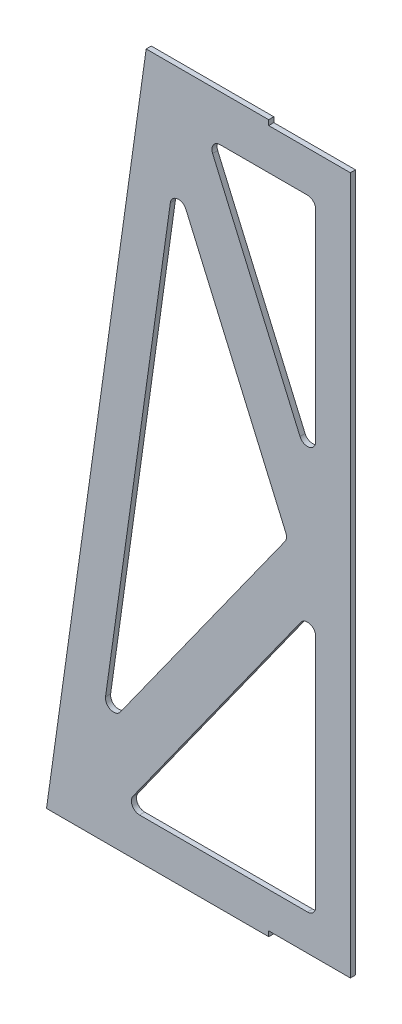
ISO-10303-21;
HEADER;
FILE_DESCRIPTION(('STEP AP214'),'2;1');
FILE_NAME('part.step','',(''),(''),'','','');
FILE_SCHEMA(('AUTOMOTIVE_DESIGN { 1 0 10303 214 1 1 1 1 }'));
ENDSEC;
DATA;
#1=APPLICATION_CONTEXT('core data for automotive mechanical design processes');
#2=APPLICATION_PROTOCOL_DEFINITION('international standard','automotive_design',2000,#1);
#3=PRODUCT_CONTEXT('',#1,'mechanical');
#4=PRODUCT('Part','Part','',(#3));
#5=PRODUCT_RELATED_PRODUCT_CATEGORY('part','',(#4));
#6=PRODUCT_DEFINITION_FORMATION('','',#4);
#7=PRODUCT_DEFINITION_CONTEXT('part definition',#1,'design');
#8=PRODUCT_DEFINITION('design','',#6,#7);
#9=PRODUCT_DEFINITION_SHAPE('','',#8);
#10=(LENGTH_UNIT() NAMED_UNIT(*) SI_UNIT(.MILLI.,.METRE.));
#11=(NAMED_UNIT(*) PLANE_ANGLE_UNIT() SI_UNIT($,.RADIAN.));
#12=(NAMED_UNIT(*) SI_UNIT($,.STERADIAN.) SOLID_ANGLE_UNIT());
#13=UNCERTAINTY_MEASURE_WITH_UNIT(LENGTH_MEASURE(1.E-05),#10,'distance_accuracy_value','');
#14=(GEOMETRIC_REPRESENTATION_CONTEXT(3) GLOBAL_UNCERTAINTY_ASSIGNED_CONTEXT((#13)) GLOBAL_UNIT_ASSIGNED_CONTEXT((#10,
#11,#12)) REPRESENTATION_CONTEXT('',''));
#15=CARTESIAN_POINT('',(0.,0.,0.));
#16=DIRECTION('',(0.,0.,1.));
#17=DIRECTION('',(1.,0.,0.));
#18=AXIS2_PLACEMENT_3D('',#15,#16,#17);
#19=CARTESIAN_POINT('',(38.1,12.9979716705998,1.5875));
#20=DIRECTION('',(0.,-1.,0.));
#21=DIRECTION('',(0.,0.,-1.));
#22=AXIS2_PLACEMENT_3D('',#19,#20,#21);
#23=PLANE('',#22);
#24=DIRECTION('',(-1.,0.,0.));
#25=VECTOR('',#24,1.);
#26=CARTESIAN_POINT('',(38.1,12.9979716705998,0.));
#27=LINE('',#26,#25);
#28=CARTESIAN_POINT('',(63.5,12.9979716705998,0.));
#29=VERTEX_POINT('',#28);
#30=CARTESIAN_POINT('',(38.1,12.9979716705998,0.));
#31=VERTEX_POINT('',#30);
#32=EDGE_CURVE('E233',#29,#31,#27,.T.);
#33=ORIENTED_EDGE('',*,*,#32,.T.);
#34=DIRECTION('',(0.,0.,-1.));
#35=VECTOR('',#34,1.);
#36=CARTESIAN_POINT('',(38.1,12.9979716705998,1.5875));
#37=LINE('',#36,#35);
#38=CARTESIAN_POINT('',(38.1,12.9979716705998,1.5875));
#39=VERTEX_POINT('',#38);
#40=EDGE_CURVE('E256',#39,#31,#37,.T.);
#41=ORIENTED_EDGE('',*,*,#40,.F.);
#42=DIRECTION('',(-1.,0.,0.));
#43=VECTOR('',#42,1.);
#44=CARTESIAN_POINT('',(38.1,12.9979716705998,1.5875));
#45=LINE('',#44,#43);
#46=CARTESIAN_POINT('',(63.5,12.9979716705998,1.5875));
#47=VERTEX_POINT('',#46);
#48=EDGE_CURVE('E234',#47,#39,#45,.T.);
#49=ORIENTED_EDGE('',*,*,#48,.F.);
#50=DIRECTION('',(0.,0.,-1.));
#51=VECTOR('',#50,1.);
#52=CARTESIAN_POINT('',(63.5,12.9979716705998,1.5875));
#53=LINE('',#52,#51);
#54=EDGE_CURVE('E245',#47,#29,#53,.T.);
#55=ORIENTED_EDGE('',*,*,#54,.T.);
#56=EDGE_LOOP('',(#33,#41,#49,#55));
#57=FACE_BOUND('',#56,.T.);
#58=ADVANCED_FACE('F37',(#57),#23,.F.);
#59=CARTESIAN_POINT('',(38.1,14.5854716705998,1.5875));
#60=DIRECTION('',(-1.,0.,0.));
#61=DIRECTION('',(0.,0.,1.));
#62=AXIS2_PLACEMENT_3D('',#59,#60,#61);
#63=PLANE('',#62);
#64=DIRECTION('',(0.,1.,0.));
#65=VECTOR('',#64,1.);
#66=CARTESIAN_POINT('',(38.1,14.5854716705998,0.));
#67=LINE('',#66,#65);
#68=CARTESIAN_POINT('',(38.1,14.5854716705998,0.));
#69=VERTEX_POINT('',#68);
#70=EDGE_CURVE('E418',#31,#69,#67,.T.);
#71=ORIENTED_EDGE('',*,*,#70,.T.);
#72=DIRECTION('',(0.,0.,-1.));
#73=VECTOR('',#72,1.);
#74=CARTESIAN_POINT('',(38.1,14.5854716705998,1.5875));
#75=LINE('',#74,#73);
#76=CARTESIAN_POINT('',(38.1,14.5854716705998,1.5875));
#77=VERTEX_POINT('',#76);
#78=EDGE_CURVE('E253',#77,#69,#75,.T.);
#79=ORIENTED_EDGE('',*,*,#78,.F.);
#80=DIRECTION('',(0.,1.,0.));
#81=VECTOR('',#80,1.);
#82=CARTESIAN_POINT('',(38.1,14.5854716705998,1.5875));
#83=LINE('',#82,#81);
#84=EDGE_CURVE('E238',#39,#77,#83,.T.);
#85=ORIENTED_EDGE('',*,*,#84,.F.);
#86=ORIENTED_EDGE('',*,*,#40,.T.);
#87=EDGE_LOOP('',(#71,#79,#85,#86));
#88=FACE_BOUND('',#87,.T.);
#89=ADVANCED_FACE('F448',(#88),#63,.F.);
#90=CARTESIAN_POINT('',(0.,14.5854716705998,1.5875));
#91=DIRECTION('',(0.,-1.,0.));
#92=DIRECTION('',(0.,0.,-1.));
#93=AXIS2_PLACEMENT_3D('',#90,#91,#92);
#94=PLANE('',#93);
#95=DIRECTION('',(-1.,0.,0.));
#96=VECTOR('',#95,1.);
#97=CARTESIAN_POINT('',(0.,14.5854716705998,0.));
#98=LINE('',#97,#96);
#99=CARTESIAN_POINT('',(0.,14.5854716705998,0.));
#100=VERTEX_POINT('',#99);
#101=EDGE_CURVE('E420',#69,#100,#98,.T.);
#102=ORIENTED_EDGE('',*,*,#101,.T.);
#103=DIRECTION('',(0.,0.,-1.));
#104=VECTOR('',#103,1.);
#105=CARTESIAN_POINT('',(0.,14.5854716705998,1.5875));
#106=LINE('',#105,#104);
#107=CARTESIAN_POINT('',(0.,14.5854716705998,1.5875));
#108=VERTEX_POINT('',#107);
#109=EDGE_CURVE('E250',#108,#100,#106,.T.);
#110=ORIENTED_EDGE('',*,*,#109,.F.);
#111=DIRECTION('',(-1.,0.,0.));
#112=VECTOR('',#111,1.);
#113=CARTESIAN_POINT('',(0.,14.5854716705998,1.5875));
#114=LINE('',#113,#112);
#115=EDGE_CURVE('E409',#77,#108,#114,.T.);
#116=ORIENTED_EDGE('',*,*,#115,.F.);
#117=ORIENTED_EDGE('',*,*,#78,.T.);
#118=EDGE_LOOP('',(#102,#110,#116,#117));
#119=FACE_BOUND('',#118,.T.);
#120=ADVANCED_FACE('F445',(#119),#94,.F.);
#121=CARTESIAN_POINT('',(-30.988,-205.4420283294,1.5875));
#122=DIRECTION('',(0.990227616842421,-0.139460628288341,0.));
#123=DIRECTION('',(0.139460628288341,0.990227616842421,0.));
#124=AXIS2_PLACEMENT_3D('',#121,#122,#123);
#125=PLANE('',#124);
#126=DIRECTION('',(-0.139460628288341,-0.990227616842421,0.));
#127=VECTOR('',#126,1.);
#128=CARTESIAN_POINT('',(-30.988,-205.4420283294,0.));
#129=LINE('',#128,#127);
#130=CARTESIAN_POINT('',(-30.988,-205.4420283294,0.));
#131=VERTEX_POINT('',#130);
#132=EDGE_CURVE('E241',#100,#131,#129,.T.);
#133=ORIENTED_EDGE('',*,*,#132,.T.);
#134=DIRECTION('',(0.,0.,-1.));
#135=VECTOR('',#134,1.);
#136=CARTESIAN_POINT('',(-30.988,-205.4420283294,1.5875));
#137=LINE('',#136,#135);
#138=CARTESIAN_POINT('',(-30.988,-205.4420283294,1.5875));
#139=VERTEX_POINT('',#138);
#140=EDGE_CURVE('E247',#139,#131,#137,.T.);
#141=ORIENTED_EDGE('',*,*,#140,.F.);
#142=DIRECTION('',(-0.139460628288341,-0.990227616842421,0.));
#143=VECTOR('',#142,1.);
#144=CARTESIAN_POINT('',(-30.988,-205.4420283294,1.5875));
#145=LINE('',#144,#143);
#146=EDGE_CURVE('E411',#108,#139,#145,.T.);
#147=ORIENTED_EDGE('',*,*,#146,.F.);
#148=ORIENTED_EDGE('',*,*,#109,.T.);
#149=EDGE_LOOP('',(#133,#141,#147,#148));
#150=FACE_BOUND('',#149,.T.);
#151=ADVANCED_FACE('F424',(#150),#125,.F.);
#152=CARTESIAN_POINT('',(63.5,-205.4420283294,1.5875));
#153=DIRECTION('',(0.,1.,0.));
#154=DIRECTION('',(-1.,0.,0.));
#155=AXIS2_PLACEMENT_3D('',#152,#153,#154);
#156=PLANE('',#155);
#157=DIRECTION('',(1.,0.,0.));
#158=VECTOR('',#157,1.);
#159=CARTESIAN_POINT('',(63.5,-205.4420283294,0.));
#160=LINE('',#159,#158);
#161=CARTESIAN_POINT('',(38.1,-205.4420283294,0.));
#162=VERTEX_POINT('',#161);
#163=EDGE_CURVE('E235',#131,#162,#160,.T.);
#164=ORIENTED_EDGE('',*,*,#163,.T.);
#165=DIRECTION('',(0.,0.,1.));
#166=VECTOR('',#165,1.);
#167=CARTESIAN_POINT('',(38.1,-205.4420283294,0.));
#168=LINE('',#167,#166);
#169=CARTESIAN_POINT('',(38.1,-205.4420283294,1.5875));
#170=VERTEX_POINT('',#169);
#171=EDGE_CURVE('E351',#162,#170,#168,.T.);
#172=ORIENTED_EDGE('',*,*,#171,.T.);
#173=DIRECTION('',(1.,0.,0.));
#174=VECTOR('',#173,1.);
#175=CARTESIAN_POINT('',(63.5,-205.4420283294,1.5875));
#176=LINE('',#175,#174);
#177=EDGE_CURVE('E413',#139,#170,#176,.T.);
#178=ORIENTED_EDGE('',*,*,#177,.F.);
#179=ORIENTED_EDGE('',*,*,#140,.T.);
#180=EDGE_LOOP('',(#164,#172,#178,#179));
#181=FACE_BOUND('',#180,.T.);
#182=ADVANCED_FACE('F431',(#181),#156,.F.);
#183=CARTESIAN_POINT('',(63.5,12.9979716705998,1.5875));
#184=DIRECTION('',(-1.,0.,0.));
#185=DIRECTION('',(0.,-1.,0.));
#186=AXIS2_PLACEMENT_3D('',#183,#184,#185);
#187=PLANE('',#186);
#188=DIRECTION('',(0.,1.,0.));
#189=VECTOR('',#188,1.);
#190=CARTESIAN_POINT('',(63.5,12.9979716705998,1.5875));
#191=LINE('',#190,#189);
#192=CARTESIAN_POINT('',(63.5,-203.8545283294,1.5875));
#193=VERTEX_POINT('',#192);
#194=EDGE_CURVE('E227',#193,#47,#191,.T.);
#195=ORIENTED_EDGE('',*,*,#194,.F.);
#196=DIRECTION('',(0.,0.,1.));
#197=VECTOR('',#196,1.);
#198=CARTESIAN_POINT('',(63.5,-203.8545283294,0.));
#199=LINE('',#198,#197);
#200=CARTESIAN_POINT('',(63.5,-203.8545283294,0.));
#201=VERTEX_POINT('',#200);
#202=EDGE_CURVE('E214',#201,#193,#199,.T.);
#203=ORIENTED_EDGE('',*,*,#202,.F.);
#204=DIRECTION('',(0.,1.,0.));
#205=VECTOR('',#204,1.);
#206=CARTESIAN_POINT('',(63.5,12.9979716705998,0.));
#207=LINE('',#206,#205);
#208=EDGE_CURVE('E225',#201,#29,#207,.T.);
#209=ORIENTED_EDGE('',*,*,#208,.T.);
#210=ORIENTED_EDGE('',*,*,#54,.F.);
#211=EDGE_LOOP('',(#195,#203,#209,#210));
#212=FACE_BOUND('',#211,.T.);
#213=ADVANCED_FACE('F223',(#212),#187,.F.);
#214=CARTESIAN_POINT('',(0.,0.,1.5875));
#215=DIRECTION('',(0.,0.,-1.));
#216=DIRECTION('',(-1.,0.,0.));
#217=AXIS2_PLACEMENT_3D('',#214,#215,#216);
#218=PLANE('',#217);
#219=DIRECTION('',(-0.58195972298343,-0.813217609760788,0.));
#220=VECTOR('',#219,1.);
#221=CARTESIAN_POINT('',(-7.00385109472523,-192.7420283294,1.5875));
#222=LINE('',#221,#220);
#223=CARTESIAN_POINT('',(48.0926188765195,-115.751443162137,1.5875));
#224=VERTEX_POINT('',#223);
#225=CARTESIAN_POINT('',(-4.12833837707744,-188.723850633022,1.5875));
#226=VERTEX_POINT('',#225);
#227=EDGE_CURVE('E387',#224,#226,#222,.T.);
#228=ORIENTED_EDGE('',*,*,#227,.F.);
#229=CARTESIAN_POINT('',(50.1581916053119,-117.229620858515,1.5875));
#230=DIRECTION('',(0.,0.,-1.));
#231=DIRECTION('',(-1.,0.,0.));
#232=AXIS2_PLACEMENT_3D('',#229,#230,#231);
#233=CIRCLE('',#232,2.54);
#234=CARTESIAN_POINT('',(52.6981916053119,-117.229620858515,1.5875));
#235=VERTEX_POINT('',#234);
#236=EDGE_CURVE('E323',#224,#235,#233,.T.);
#237=ORIENTED_EDGE('',*,*,#236,.T.);
#238=DIRECTION('',(0.,1.,0.));
#239=VECTOR('',#238,1.);
#240=CARTESIAN_POINT('',(52.6981916053119,-192.7420283294,1.5875));
#241=LINE('',#240,#239);
#242=CARTESIAN_POINT('',(52.6981916053119,-190.2020283294,1.5875));
#243=VERTEX_POINT('',#242);
#244=EDGE_CURVE('E367',#243,#235,#241,.T.);
#245=ORIENTED_EDGE('',*,*,#244,.F.);
#246=CARTESIAN_POINT('',(50.1581916053119,-190.2020283294,1.5875));
#247=DIRECTION('',(0.,0.,-1.));
#248=DIRECTION('',(-1.,0.,0.));
#249=AXIS2_PLACEMENT_3D('',#246,#247,#248);
#250=CIRCLE('',#249,2.54);
#251=CARTESIAN_POINT('',(50.1581916053119,-192.7420283294,1.5875));
#252=VERTEX_POINT('',#251);
#253=EDGE_CURVE('E327',#243,#252,#250,.T.);
#254=ORIENTED_EDGE('',*,*,#253,.T.);
#255=DIRECTION('',(1.,0.,0.));
#256=VECTOR('',#255,1.);
#257=CARTESIAN_POINT('',(-7.00385109472523,-192.7420283294,1.5875));
#258=LINE('',#257,#256);
#259=CARTESIAN_POINT('',(-2.06276564828504,-192.7420283294,1.5875));
#260=VERTEX_POINT('',#259);
#261=EDGE_CURVE('E379',#260,#252,#258,.T.);
#262=ORIENTED_EDGE('',*,*,#261,.F.);
#263=CARTESIAN_POINT('',(-2.06276564828504,-190.2020283294,1.5875));
#264=DIRECTION('',(0.,0.,-1.));
#265=DIRECTION('',(-1.,0.,0.));
#266=AXIS2_PLACEMENT_3D('',#263,#264,#265);
#267=CIRCLE('',#266,2.54);
#268=EDGE_CURVE('E331',#260,#226,#267,.T.);
#269=ORIENTED_EDGE('',*,*,#268,.T.);
#270=EDGE_LOOP('',(#228,#237,#245,#254,#262,#269));
#271=FACE_BOUND('',#270,.T.);
#272=DIRECTION('',(0.58195972298343,0.813217609760788,0.));
#273=VECTOR('',#272,1.);
#274=CARTESIAN_POINT('',(-14.0781195108393,-176.440074820993,1.5875));
#275=LINE('',#274,#273);
#276=CARTESIAN_POINT('',(-8.05367213328927,-168.021645670286,1.5875));
#277=VERTEX_POINT('',#276);
#278=CARTESIAN_POINT('',(43.1530180399591,-96.4665525223091,1.5875));
#279=VERTEX_POINT('',#278);
#280=EDGE_CURVE('E342',#277,#279,#275,.T.);
#281=ORIENTED_EDGE('',*,*,#280,.F.);
#282=CARTESIAN_POINT('',(-10.1192448620817,-166.543467973908,1.5875));
#283=DIRECTION('',(0.,0.,-1.));
#284=DIRECTION('',(-1.,0.,0.));
#285=AXIS2_PLACEMENT_3D('',#282,#283,#284);
#286=CIRCLE('',#285,2.54);
#287=CARTESIAN_POINT('',(-12.6344230088614,-166.189237978056,1.5875));
#288=VERTEX_POINT('',#287);
#289=EDGE_CURVE('E45',#277,#288,#286,.T.);
#290=ORIENTED_EDGE('',*,*,#289,.T.);
#291=DIRECTION('',(-0.139460628288341,-0.990227616842421,0.));
#292=VECTOR('',#291,1.);
#293=CARTESIAN_POINT('',(8.77782500296553,-14.1535015826041,1.5875));
#294=LINE('',#293,#292);
#295=CARTESIAN_POINT('',(7.52077783166543,-23.0790516821017,1.5875));
#296=VERTEX_POINT('',#295);
#297=EDGE_CURVE('E340',#296,#288,#294,.T.);
#298=ORIENTED_EDGE('',*,*,#297,.F.);
#299=CARTESIAN_POINT('',(10.0359559784452,-23.4332816779541,1.5875));
#300=DIRECTION('',(0.,0.,-1.));
#301=DIRECTION('',(-1.,0.,0.));
#302=AXIS2_PLACEMENT_3D('',#299,#300,#301);
#303=CIRCLE('',#302,2.54);
#304=CARTESIAN_POINT('',(12.3660208793052,-22.4221449128327,1.5875));
#305=VERTEX_POINT('',#304);
#306=EDGE_CURVE('E303',#296,#305,#303,.T.);
#307=ORIENTED_EDGE('',*,*,#306,.T.);
#308=DIRECTION('',(-0.398085340598966,0.917348386165368,0.));
#309=VECTOR('',#308,1.);
#310=CARTESIAN_POINT('',(43.990131884703,-95.2967882017984,1.5875));
#311=LINE('',#310,#309);
#312=CARTESIAN_POINT('',(43.4175102120267,-93.9772380608098,1.5875));
#313=VERTEX_POINT('',#312);
#314=EDGE_CURVE('E369',#313,#305,#311,.T.);
#315=ORIENTED_EDGE('',*,*,#314,.F.);
#316=CARTESIAN_POINT('',(41.0874453111667,-94.9883748259312,1.5875));
#317=DIRECTION('',(0.,0.,-1.));
#318=DIRECTION('',(-1.,0.,0.));
#319=AXIS2_PLACEMENT_3D('',#316,#317,#318);
#320=CIRCLE('',#319,2.54);
#321=EDGE_CURVE('E319',#313,#279,#320,.T.);
#322=ORIENTED_EDGE('',*,*,#321,.T.);
#323=EDGE_LOOP('',(#281,#290,#298,#307,#315,#322));
#324=FACE_BOUND('',#323,.T.);
#325=DIRECTION('',(-1.,0.,0.));
#326=VECTOR('',#325,1.);
#327=CARTESIAN_POINT('',(19.1196760280692,0.297971670599759,1.5875));
#328=LINE('',#327,#326);
#329=CARTESIAN_POINT('',(50.1581916053118,0.297971670599777,1.5875));
#330=VERTEX_POINT('',#329);
#331=CARTESIAN_POINT('',(22.9907645029348,0.297971670599761,1.5875));
#332=VERTEX_POINT('',#331);
#333=EDGE_CURVE('E403',#330,#332,#328,.T.);
#334=ORIENTED_EDGE('',*,*,#333,.F.);
#335=CARTESIAN_POINT('',(50.1581916053118,-2.24202832940022,1.5875));
#336=DIRECTION('',(0.,0.,-1.));
#337=DIRECTION('',(-1.,0.,0.));
#338=AXIS2_PLACEMENT_3D('',#335,#336,#337);
#339=CIRCLE('',#338,2.54);
#340=CARTESIAN_POINT('',(52.6981916053118,-2.24202832940022,1.5875));
#341=VERTEX_POINT('',#340);
#342=EDGE_CURVE('E311',#330,#341,#339,.T.);
#343=ORIENTED_EDGE('',*,*,#342,.T.);
#344=DIRECTION('',(0.,1.,0.));
#345=VECTOR('',#344,1.);
#346=CARTESIAN_POINT('',(52.6981916053118,0.297971670599778,1.5875));
#347=LINE('',#346,#345);
#348=CARTESIAN_POINT('',(52.6981916053118,-64.8466833290863,1.5875));
#349=VERTEX_POINT('',#348);
#350=EDGE_CURVE('E384',#349,#341,#347,.T.);
#351=ORIENTED_EDGE('',*,*,#350,.F.);
#352=CARTESIAN_POINT('',(50.1581916053118,-64.8466833290863,1.5875));
#353=DIRECTION('',(0.,0.,-1.));
#354=DIRECTION('',(-1.,0.,0.));
#355=AXIS2_PLACEMENT_3D('',#352,#353,#354);
#356=CIRCLE('',#355,2.54);
#357=CARTESIAN_POINT('',(47.8281267044518,-65.8578200942077,1.5875));
#358=VERTEX_POINT('',#357);
#359=EDGE_CURVE('E315',#349,#358,#356,.T.);
#360=ORIENTED_EDGE('',*,*,#359,.T.);
#361=DIRECTION('',(0.398085340598966,-0.917348386165368,0.));
#362=VECTOR('',#361,1.);
#363=CARTESIAN_POINT('',(52.6981916053118,-77.0804041024573,1.5875));
#364=LINE('',#363,#362);
#365=CARTESIAN_POINT('',(20.6606996020748,-3.25316509452162,1.5875));
#366=VERTEX_POINT('',#365);
#367=EDGE_CURVE('E395',#366,#358,#364,.T.);
#368=ORIENTED_EDGE('',*,*,#367,.F.);
#369=CARTESIAN_POINT('',(22.9907645029348,-2.24202832940024,1.5875));
#370=DIRECTION('',(0.,0.,-1.));
#371=DIRECTION('',(-1.,0.,0.));
#372=AXIS2_PLACEMENT_3D('',#369,#370,#371);
#373=CIRCLE('',#372,2.54);
#374=EDGE_CURVE('E307',#366,#332,#373,.T.);
#375=ORIENTED_EDGE('',*,*,#374,.T.);
#376=EDGE_LOOP('',(#334,#343,#351,#360,#368,#375));
#377=FACE_BOUND('',#376,.T.);
#378=ORIENTED_EDGE('',*,*,#177,.T.);
#379=DIRECTION('',(0.,-1.,0.));
#380=VECTOR('',#379,1.);
#381=CARTESIAN_POINT('',(38.1,-205.4420283294,1.5875));
#382=LINE('',#381,#380);
#383=CARTESIAN_POINT('',(38.1,-203.8545283294,1.5875));
#384=VERTEX_POINT('',#383);
#385=EDGE_CURVE('E219',#384,#170,#382,.T.);
#386=ORIENTED_EDGE('',*,*,#385,.F.);
#387=DIRECTION('',(-1.,0.,0.));
#388=VECTOR('',#387,1.);
#389=CARTESIAN_POINT('',(63.5,-203.8545283294,1.5875));
#390=LINE('',#389,#388);
#391=EDGE_CURVE('E435',#193,#384,#390,.T.);
#392=ORIENTED_EDGE('',*,*,#391,.F.);
#393=ORIENTED_EDGE('',*,*,#194,.T.);
#394=ORIENTED_EDGE('',*,*,#48,.T.);
#395=ORIENTED_EDGE('',*,*,#84,.T.);
#396=ORIENTED_EDGE('',*,*,#115,.T.);
#397=ORIENTED_EDGE('',*,*,#146,.T.);
#398=EDGE_LOOP('',(#378,#386,#392,#393,#394,#395,#396,#397));
#399=FACE_BOUND('',#398,.T.);
#400=ADVANCED_FACE('F338',(#271,#324,#377,#399),#218,.F.);
#401=CARTESIAN_POINT('',(0.,0.,0.));
#402=DIRECTION('',(0.,0.,-1.));
#403=DIRECTION('',(-1.,0.,0.));
#404=AXIS2_PLACEMENT_3D('',#401,#402,#403);
#405=PLANE('',#404);
#406=DIRECTION('',(0.,-1.,0.));
#407=VECTOR('',#406,1.);
#408=CARTESIAN_POINT('',(38.1,-205.4420283294,0.));
#409=LINE('',#408,#407);
#410=CARTESIAN_POINT('',(38.1,-203.8545283294,0.));
#411=VERTEX_POINT('',#410);
#412=EDGE_CURVE('E52',#411,#162,#409,.T.);
#413=ORIENTED_EDGE('',*,*,#412,.T.);
#414=ORIENTED_EDGE('',*,*,#163,.F.);
#415=ORIENTED_EDGE('',*,*,#132,.F.);
#416=ORIENTED_EDGE('',*,*,#101,.F.);
#417=ORIENTED_EDGE('',*,*,#70,.F.);
#418=ORIENTED_EDGE('',*,*,#32,.F.);
#419=ORIENTED_EDGE('',*,*,#208,.F.);
#420=DIRECTION('',(-1.,0.,0.));
#421=VECTOR('',#420,1.);
#422=CARTESIAN_POINT('',(63.5,-203.8545283294,0.));
#423=LINE('',#422,#421);
#424=EDGE_CURVE('E210',#201,#411,#423,.T.);
#425=ORIENTED_EDGE('',*,*,#424,.T.);
#426=EDGE_LOOP('',(#413,#414,#415,#416,#417,#418,#419,#425));
#427=FACE_BOUND('',#426,.T.);
#428=DIRECTION('',(1.,0.,0.));
#429=VECTOR('',#428,1.);
#430=CARTESIAN_POINT('',(-7.00385109472523,-192.7420283294,0.));
#431=LINE('',#430,#429);
#432=CARTESIAN_POINT('',(-2.06276564828504,-192.7420283294,0.));
#433=VERTEX_POINT('',#432);
#434=CARTESIAN_POINT('',(50.1581916053119,-192.7420283294,0.));
#435=VERTEX_POINT('',#434);
#436=EDGE_CURVE('E382',#433,#435,#431,.T.);
#437=ORIENTED_EDGE('',*,*,#436,.T.);
#438=CARTESIAN_POINT('',(50.1581916053119,-190.2020283294,0.));
#439=DIRECTION('',(0.,0.,-1.));
#440=DIRECTION('',(-1.,0.,0.));
#441=AXIS2_PLACEMENT_3D('',#438,#439,#440);
#442=CIRCLE('',#441,2.54);
#443=CARTESIAN_POINT('',(52.6981916053119,-190.2020283294,0.));
#444=VERTEX_POINT('',#443);
#445=EDGE_CURVE('E329',#435,#444,#442,.F.);
#446=ORIENTED_EDGE('',*,*,#445,.T.);
#447=DIRECTION('',(0.,1.,0.));
#448=VECTOR('',#447,1.);
#449=CARTESIAN_POINT('',(52.6981916053119,-192.7420283294,0.));
#450=LINE('',#449,#448);
#451=CARTESIAN_POINT('',(52.6981916053119,-117.229620858515,0.));
#452=VERTEX_POINT('',#451);
#453=EDGE_CURVE('E375',#444,#452,#450,.T.);
#454=ORIENTED_EDGE('',*,*,#453,.T.);
#455=CARTESIAN_POINT('',(50.1581916053119,-117.229620858515,0.));
#456=DIRECTION('',(0.,0.,-1.));
#457=DIRECTION('',(-1.,0.,0.));
#458=AXIS2_PLACEMENT_3D('',#455,#456,#457);
#459=CIRCLE('',#458,2.54);
#460=CARTESIAN_POINT('',(48.0926188765195,-115.751443162137,0.));
#461=VERTEX_POINT('',#460);
#462=EDGE_CURVE('E325',#452,#461,#459,.F.);
#463=ORIENTED_EDGE('',*,*,#462,.T.);
#464=DIRECTION('',(-0.58195972298343,-0.813217609760788,0.));
#465=VECTOR('',#464,1.);
#466=CARTESIAN_POINT('',(-7.00385109472523,-192.7420283294,0.));
#467=LINE('',#466,#465);
#468=CARTESIAN_POINT('',(-4.12833837707744,-188.723850633022,0.));
#469=VERTEX_POINT('',#468);
#470=EDGE_CURVE('E378',#461,#469,#467,.T.);
#471=ORIENTED_EDGE('',*,*,#470,.T.);
#472=CARTESIAN_POINT('',(-2.06276564828504,-190.2020283294,0.));
#473=DIRECTION('',(0.,0.,-1.));
#474=DIRECTION('',(-1.,0.,0.));
#475=AXIS2_PLACEMENT_3D('',#472,#473,#474);
#476=CIRCLE('',#475,2.54);
#477=EDGE_CURVE('E333',#469,#433,#476,.F.);
#478=ORIENTED_EDGE('',*,*,#477,.T.);
#479=EDGE_LOOP('',(#437,#446,#454,#463,#471,#478));
#480=FACE_BOUND('',#479,.T.);
#481=DIRECTION('',(-0.398085340598966,0.917348386165368,0.));
#482=VECTOR('',#481,1.);
#483=CARTESIAN_POINT('',(43.990131884703,-95.2967882017984,0.));
#484=LINE('',#483,#482);
#485=CARTESIAN_POINT('',(43.4175102120267,-93.9772380608098,0.));
#486=VERTEX_POINT('',#485);
#487=CARTESIAN_POINT('',(12.3660208793052,-22.4221449128327,0.));
#488=VERTEX_POINT('',#487);
#489=EDGE_CURVE('E365',#486,#488,#484,.T.);
#490=ORIENTED_EDGE('',*,*,#489,.T.);
#491=CARTESIAN_POINT('',(10.0359559784452,-23.4332816779541,0.));
#492=DIRECTION('',(0.,0.,-1.));
#493=DIRECTION('',(-1.,0.,0.));
#494=AXIS2_PLACEMENT_3D('',#491,#492,#493);
#495=CIRCLE('',#494,2.54);
#496=CARTESIAN_POINT('',(7.52077783166543,-23.0790516821017,0.));
#497=VERTEX_POINT('',#496);
#498=EDGE_CURVE('E305',#488,#497,#495,.F.);
#499=ORIENTED_EDGE('',*,*,#498,.T.);
#500=DIRECTION('',(-0.139460628288341,-0.990227616842421,0.));
#501=VECTOR('',#500,1.);
#502=CARTESIAN_POINT('',(8.77782500296553,-14.1535015826041,0.));
#503=LINE('',#502,#501);
#504=CARTESIAN_POINT('',(-12.6344230088614,-166.189237978056,0.));
#505=VERTEX_POINT('',#504);
#506=EDGE_CURVE('E361',#497,#505,#503,.T.);
#507=ORIENTED_EDGE('',*,*,#506,.T.);
#508=CARTESIAN_POINT('',(-10.1192448620817,-166.543467973908,0.));
#509=DIRECTION('',(0.,0.,-1.));
#510=DIRECTION('',(-1.,0.,0.));
#511=AXIS2_PLACEMENT_3D('',#508,#509,#510);
#512=CIRCLE('',#511,2.54);
#513=CARTESIAN_POINT('',(-8.05367213328927,-168.021645670286,0.));
#514=VERTEX_POINT('',#513);
#515=EDGE_CURVE('E11',#505,#514,#512,.F.);
#516=ORIENTED_EDGE('',*,*,#515,.T.);
#517=DIRECTION('',(0.58195972298343,0.813217609760788,0.));
#518=VECTOR('',#517,1.);
#519=CARTESIAN_POINT('',(-14.0781195108393,-176.440074820993,0.));
#520=LINE('',#519,#518);
#521=CARTESIAN_POINT('',(43.1530180399591,-96.4665525223091,0.));
#522=VERTEX_POINT('',#521);
#523=EDGE_CURVE('E359',#514,#522,#520,.T.);
#524=ORIENTED_EDGE('',*,*,#523,.T.);
#525=CARTESIAN_POINT('',(41.0874453111667,-94.9883748259312,0.));
#526=DIRECTION('',(0.,0.,-1.));
#527=DIRECTION('',(-1.,0.,0.));
#528=AXIS2_PLACEMENT_3D('',#525,#526,#527);
#529=CIRCLE('',#528,2.54);
#530=EDGE_CURVE('E321',#522,#486,#529,.F.);
#531=ORIENTED_EDGE('',*,*,#530,.T.);
#532=EDGE_LOOP('',(#490,#499,#507,#516,#524,#531));
#533=FACE_BOUND('',#532,.T.);
#534=DIRECTION('',(0.398085340598966,-0.917348386165368,0.));
#535=VECTOR('',#534,1.);
#536=CARTESIAN_POINT('',(52.6981916053118,-77.0804041024573,0.));
#537=LINE('',#536,#535);
#538=CARTESIAN_POINT('',(20.6606996020748,-3.25316509452162,0.));
#539=VERTEX_POINT('',#538);
#540=CARTESIAN_POINT('',(47.8281267044518,-65.8578200942077,0.));
#541=VERTEX_POINT('',#540);
#542=EDGE_CURVE('E398',#539,#541,#537,.T.);
#543=ORIENTED_EDGE('',*,*,#542,.T.);
#544=CARTESIAN_POINT('',(50.1581916053118,-64.8466833290863,0.));
#545=DIRECTION('',(0.,0.,-1.));
#546=DIRECTION('',(-1.,0.,0.));
#547=AXIS2_PLACEMENT_3D('',#544,#545,#546);
#548=CIRCLE('',#547,2.54);
#549=CARTESIAN_POINT('',(52.6981916053118,-64.8466833290863,0.));
#550=VERTEX_POINT('',#549);
#551=EDGE_CURVE('E317',#541,#550,#548,.F.);
#552=ORIENTED_EDGE('',*,*,#551,.T.);
#553=DIRECTION('',(0.,1.,0.));
#554=VECTOR('',#553,1.);
#555=CARTESIAN_POINT('',(52.6981916053118,0.297971670599778,0.));
#556=LINE('',#555,#554);
#557=CARTESIAN_POINT('',(52.6981916053118,-2.24202832940022,0.));
#558=VERTEX_POINT('',#557);
#559=EDGE_CURVE('E391',#550,#558,#556,.T.);
#560=ORIENTED_EDGE('',*,*,#559,.T.);
#561=CARTESIAN_POINT('',(50.1581916053118,-2.24202832940022,0.));
#562=DIRECTION('',(0.,0.,-1.));
#563=DIRECTION('',(-1.,0.,0.));
#564=AXIS2_PLACEMENT_3D('',#561,#562,#563);
#565=CIRCLE('',#564,2.54);
#566=CARTESIAN_POINT('',(50.1581916053118,0.297971670599777,0.));
#567=VERTEX_POINT('',#566);
#568=EDGE_CURVE('E313',#558,#567,#565,.F.);
#569=ORIENTED_EDGE('',*,*,#568,.T.);
#570=DIRECTION('',(-1.,0.,0.));
#571=VECTOR('',#570,1.);
#572=CARTESIAN_POINT('',(19.1196760280692,0.297971670599759,0.));
#573=LINE('',#572,#571);
#574=CARTESIAN_POINT('',(22.9907645029348,0.297971670599761,0.));
#575=VERTEX_POINT('',#574);
#576=EDGE_CURVE('E394',#567,#575,#573,.T.);
#577=ORIENTED_EDGE('',*,*,#576,.T.);
#578=CARTESIAN_POINT('',(22.9907645029348,-2.24202832940024,0.));
#579=DIRECTION('',(0.,0.,-1.));
#580=DIRECTION('',(-1.,0.,0.));
#581=AXIS2_PLACEMENT_3D('',#578,#579,#580);
#582=CIRCLE('',#581,2.54);
#583=EDGE_CURVE('E309',#575,#539,#582,.F.);
#584=ORIENTED_EDGE('',*,*,#583,.T.);
#585=EDGE_LOOP('',(#543,#552,#560,#569,#577,#584));
#586=FACE_BOUND('',#585,.T.);
#587=ADVANCED_FACE('F230',(#427,#480,#533,#586),#405,.T.);
#588=CARTESIAN_POINT('',(52.6981916053118,0.297971670599778,0.));
#589=DIRECTION('',(1.,0.,0.));
#590=DIRECTION('',(0.,1.,0.));
#591=AXIS2_PLACEMENT_3D('',#588,#589,#590);
#592=PLANE('',#591);
#593=ORIENTED_EDGE('',*,*,#350,.T.);
#594=DIRECTION('',(0.,0.,1.));
#595=VECTOR('',#594,1.);
#596=CARTESIAN_POINT('',(52.6981916053118,-2.24202832940022,0.));
#597=LINE('',#596,#595);
#598=EDGE_CURVE('E282',#341,#558,#597,.F.);
#599=ORIENTED_EDGE('',*,*,#598,.T.);
#600=ORIENTED_EDGE('',*,*,#559,.F.);
#601=DIRECTION('',(0.,0.,1.));
#602=VECTOR('',#601,1.);
#603=CARTESIAN_POINT('',(52.6981916053118,-64.8466833290863,1.5875));
#604=LINE('',#603,#602);
#605=EDGE_CURVE('E279',#550,#349,#604,.T.);
#606=ORIENTED_EDGE('',*,*,#605,.T.);
#607=EDGE_LOOP('',(#593,#599,#600,#606));
#608=FACE_BOUND('',#607,.T.);
#609=ADVANCED_FACE('F525',(#608),#592,.F.);
#610=CARTESIAN_POINT('',(52.6981916053118,-77.0804041024573,0.));
#611=DIRECTION('',(-0.917348386165368,-0.398085340598966,0.));
#612=DIRECTION('',(0.398085340598966,-0.917348386165368,0.));
#613=AXIS2_PLACEMENT_3D('',#610,#611,#612);
#614=PLANE('',#613);
#615=ORIENTED_EDGE('',*,*,#542,.F.);
#616=DIRECTION('',(0.,0.,1.));
#617=VECTOR('',#616,1.);
#618=CARTESIAN_POINT('',(20.6606996020748,-3.25316509452161,1.5875));
#619=LINE('',#618,#617);
#620=EDGE_CURVE('E271',#539,#366,#619,.T.);
#621=ORIENTED_EDGE('',*,*,#620,.T.);
#622=ORIENTED_EDGE('',*,*,#367,.T.);
#623=DIRECTION('',(0.,0.,1.));
#624=VECTOR('',#623,1.);
#625=CARTESIAN_POINT('',(47.8281267044518,-65.8578200942077,0.));
#626=LINE('',#625,#624);
#627=EDGE_CURVE('E269',#358,#541,#626,.F.);
#628=ORIENTED_EDGE('',*,*,#627,.T.);
#629=EDGE_LOOP('',(#615,#621,#622,#628));
#630=FACE_BOUND('',#629,.T.);
#631=ADVANCED_FACE('F521',(#630),#614,.F.);
#632=CARTESIAN_POINT('',(19.1196760280692,0.297971670599759,0.));
#633=DIRECTION('',(0.,1.,0.));
#634=DIRECTION('',(-1.,0.,0.));
#635=AXIS2_PLACEMENT_3D('',#632,#633,#634);
#636=PLANE('',#635);
#637=ORIENTED_EDGE('',*,*,#333,.T.);
#638=DIRECTION('',(0.,0.,1.));
#639=VECTOR('',#638,1.);
#640=CARTESIAN_POINT('',(22.9907645029348,0.297971670599761,0.));
#641=LINE('',#640,#639);
#642=EDGE_CURVE('E277',#332,#575,#641,.F.);
#643=ORIENTED_EDGE('',*,*,#642,.T.);
#644=ORIENTED_EDGE('',*,*,#576,.F.);
#645=DIRECTION('',(0.,0.,1.));
#646=VECTOR('',#645,1.);
#647=CARTESIAN_POINT('',(50.1581916053118,0.297971670599777,1.5875));
#648=LINE('',#647,#646);
#649=EDGE_CURVE('E274',#567,#330,#648,.T.);
#650=ORIENTED_EDGE('',*,*,#649,.T.);
#651=EDGE_LOOP('',(#637,#643,#644,#650));
#652=FACE_BOUND('',#651,.T.);
#653=ADVANCED_FACE('F524',(#652),#636,.F.);
#654=CARTESIAN_POINT('',(8.77782500296553,-14.1535015826041,0.));
#655=DIRECTION('',(-0.990227616842421,0.139460628288341,0.));
#656=DIRECTION('',(-0.139460628288341,-0.990227616842421,0.));
#657=AXIS2_PLACEMENT_3D('',#654,#655,#656);
#658=PLANE('',#657);
#659=ORIENTED_EDGE('',*,*,#506,.F.);
#660=DIRECTION('',(0.,0.,1.));
#661=VECTOR('',#660,1.);
#662=CARTESIAN_POINT('',(7.52077783166543,-23.0790516821017,1.5875));
#663=LINE('',#662,#661);
#664=EDGE_CURVE('E261',#497,#296,#663,.T.);
#665=ORIENTED_EDGE('',*,*,#664,.T.);
#666=ORIENTED_EDGE('',*,*,#297,.T.);
#667=DIRECTION('',(0.,0.,1.));
#668=VECTOR('',#667,1.);
#669=CARTESIAN_POINT('',(-12.6344230088614,-166.189237978056,0.));
#670=LINE('',#669,#668);
#671=EDGE_CURVE('E259',#288,#505,#670,.F.);
#672=ORIENTED_EDGE('',*,*,#671,.T.);
#673=EDGE_LOOP('',(#659,#665,#666,#672));
#674=FACE_BOUND('',#673,.T.);
#675=ADVANCED_FACE('F348',(#674),#658,.F.);
#676=CARTESIAN_POINT('',(43.990131884703,-95.2967882017984,0.));
#677=DIRECTION('',(0.917348386165368,0.398085340598966,0.));
#678=DIRECTION('',(-0.398085340598966,0.917348386165368,0.));
#679=AXIS2_PLACEMENT_3D('',#676,#677,#678);
#680=PLANE('',#679);
#681=ORIENTED_EDGE('',*,*,#314,.T.);
#682=DIRECTION('',(0.,0.,1.));
#683=VECTOR('',#682,1.);
#684=CARTESIAN_POINT('',(12.3660208793052,-22.4221449128327,0.));
#685=LINE('',#684,#683);
#686=EDGE_CURVE('E267',#305,#488,#685,.F.);
#687=ORIENTED_EDGE('',*,*,#686,.T.);
#688=ORIENTED_EDGE('',*,*,#489,.F.);
#689=DIRECTION('',(0.,0.,1.));
#690=VECTOR('',#689,1.);
#691=CARTESIAN_POINT('',(43.4175102120267,-93.9772380608098,1.5875));
#692=LINE('',#691,#690);
#693=EDGE_CURVE('E264',#486,#313,#692,.T.);
#694=ORIENTED_EDGE('',*,*,#693,.T.);
#695=EDGE_LOOP('',(#681,#687,#688,#694));
#696=FACE_BOUND('',#695,.T.);
#697=ADVANCED_FACE('F587',(#696),#680,.F.);
#698=CARTESIAN_POINT('',(-14.0781195108393,-176.440074820993,0.));
#699=DIRECTION('',(0.813217609760788,-0.58195972298343,0.));
#700=DIRECTION('',(0.58195972298343,0.813217609760788,0.));
#701=AXIS2_PLACEMENT_3D('',#698,#699,#700);
#702=PLANE('',#701);
#703=ORIENTED_EDGE('',*,*,#280,.T.);
#704=DIRECTION('',(0.,0.,1.));
#705=VECTOR('',#704,1.);
#706=CARTESIAN_POINT('',(43.1530180399591,-96.4665525223091,0.));
#707=LINE('',#706,#705);
#708=EDGE_CURVE('E287',#279,#522,#707,.F.);
#709=ORIENTED_EDGE('',*,*,#708,.T.);
#710=ORIENTED_EDGE('',*,*,#523,.F.);
#711=DIRECTION('',(0.,0.,1.));
#712=VECTOR('',#711,1.);
#713=CARTESIAN_POINT('',(-8.05367213328926,-168.021645670286,1.5875));
#714=LINE('',#713,#712);
#715=EDGE_CURVE('E284',#514,#277,#714,.T.);
#716=ORIENTED_EDGE('',*,*,#715,.T.);
#717=EDGE_LOOP('',(#703,#709,#710,#716));
#718=FACE_BOUND('',#717,.T.);
#719=ADVANCED_FACE('F363',(#718),#702,.F.);
#720=CARTESIAN_POINT('',(52.6981916053119,-192.7420283294,0.));
#721=DIRECTION('',(1.,0.,0.));
#722=DIRECTION('',(0.,1.,0.));
#723=AXIS2_PLACEMENT_3D('',#720,#721,#722);
#724=PLANE('',#723);
#725=ORIENTED_EDGE('',*,*,#244,.T.);
#726=DIRECTION('',(0.,0.,1.));
#727=VECTOR('',#726,1.);
#728=CARTESIAN_POINT('',(52.6981916053119,-117.229620858515,0.));
#729=LINE('',#728,#727);
#730=EDGE_CURVE('E297',#235,#452,#729,.F.);
#731=ORIENTED_EDGE('',*,*,#730,.T.);
#732=ORIENTED_EDGE('',*,*,#453,.F.);
#733=DIRECTION('',(0.,0.,1.));
#734=VECTOR('',#733,1.);
#735=CARTESIAN_POINT('',(52.6981916053119,-190.2020283294,1.5875));
#736=LINE('',#735,#734);
#737=EDGE_CURVE('E294',#444,#243,#736,.T.);
#738=ORIENTED_EDGE('',*,*,#737,.T.);
#739=EDGE_LOOP('',(#725,#731,#732,#738));
#740=FACE_BOUND('',#739,.T.);
#741=ADVANCED_FACE('F506',(#740),#724,.F.);
#742=CARTESIAN_POINT('',(-7.00385109472523,-192.7420283294,0.));
#743=DIRECTION('',(0.,-1.,0.));
#744=DIRECTION('',(1.,0.,0.));
#745=AXIS2_PLACEMENT_3D('',#742,#743,#744);
#746=PLANE('',#745);
#747=ORIENTED_EDGE('',*,*,#261,.T.);
#748=DIRECTION('',(0.,0.,1.));
#749=VECTOR('',#748,1.);
#750=CARTESIAN_POINT('',(50.1581916053119,-192.7420283294,0.));
#751=LINE('',#750,#749);
#752=EDGE_CURVE('E60',#252,#435,#751,.F.);
#753=ORIENTED_EDGE('',*,*,#752,.T.);
#754=ORIENTED_EDGE('',*,*,#436,.F.);
#755=DIRECTION('',(0.,0.,1.));
#756=VECTOR('',#755,1.);
#757=CARTESIAN_POINT('',(-2.06276564828504,-192.7420283294,1.5875));
#758=LINE('',#757,#756);
#759=EDGE_CURVE('E299',#433,#260,#758,.T.);
#760=ORIENTED_EDGE('',*,*,#759,.T.);
#761=EDGE_LOOP('',(#747,#753,#754,#760));
#762=FACE_BOUND('',#761,.T.);
#763=ADVANCED_FACE('F498',(#762),#746,.F.);
#764=CARTESIAN_POINT('',(-7.00385109472523,-192.7420283294,0.));
#765=DIRECTION('',(-0.813217609760788,0.58195972298343,0.));
#766=DIRECTION('',(-0.58195972298343,-0.813217609760788,0.));
#767=AXIS2_PLACEMENT_3D('',#764,#765,#766);
#768=PLANE('',#767);
#769=ORIENTED_EDGE('',*,*,#470,.F.);
#770=DIRECTION('',(0.,0.,1.));
#771=VECTOR('',#770,1.);
#772=CARTESIAN_POINT('',(48.0926188765194,-115.751443162137,1.5875));
#773=LINE('',#772,#771);
#774=EDGE_CURVE('E291',#461,#224,#773,.T.);
#775=ORIENTED_EDGE('',*,*,#774,.T.);
#776=ORIENTED_EDGE('',*,*,#227,.T.);
#777=DIRECTION('',(0.,0.,1.));
#778=VECTOR('',#777,1.);
#779=CARTESIAN_POINT('',(-4.12833837707745,-188.723850633022,0.));
#780=LINE('',#779,#778);
#781=EDGE_CURVE('E289',#226,#469,#780,.F.);
#782=ORIENTED_EDGE('',*,*,#781,.T.);
#783=EDGE_LOOP('',(#769,#775,#776,#782));
#784=FACE_BOUND('',#783,.T.);
#785=ADVANCED_FACE('F463',(#784),#768,.F.);
#786=CARTESIAN_POINT('',(10.0359559784452,-23.4332816779541,0.));
#787=DIRECTION('',(0.,0.,-1.));
#788=DIRECTION('',(-1.,0.,0.));
#789=AXIS2_PLACEMENT_3D('',#786,#787,#788);
#790=CYLINDRICAL_SURFACE('',#789,2.54);
#791=ORIENTED_EDGE('',*,*,#498,.F.);
#792=ORIENTED_EDGE('',*,*,#686,.F.);
#793=ORIENTED_EDGE('',*,*,#306,.F.);
#794=ORIENTED_EDGE('',*,*,#664,.F.);
#795=EDGE_LOOP('',(#791,#792,#793,#794));
#796=FACE_BOUND('',#795,.T.);
#797=ADVANCED_FACE('F459',(#796),#790,.F.);
#798=CARTESIAN_POINT('',(22.9907645029348,-2.24202832940024,0.));
#799=DIRECTION('',(0.,0.,-1.));
#800=DIRECTION('',(-1.,0.,0.));
#801=AXIS2_PLACEMENT_3D('',#798,#799,#800);
#802=CYLINDRICAL_SURFACE('',#801,2.54);
#803=ORIENTED_EDGE('',*,*,#583,.F.);
#804=ORIENTED_EDGE('',*,*,#642,.F.);
#805=ORIENTED_EDGE('',*,*,#374,.F.);
#806=ORIENTED_EDGE('',*,*,#620,.F.);
#807=EDGE_LOOP('',(#803,#804,#805,#806));
#808=FACE_BOUND('',#807,.T.);
#809=ADVANCED_FACE('F462',(#808),#802,.F.);
#810=CARTESIAN_POINT('',(50.1581916053118,-2.24202832940022,0.));
#811=DIRECTION('',(0.,0.,-1.));
#812=DIRECTION('',(-1.,0.,0.));
#813=AXIS2_PLACEMENT_3D('',#810,#811,#812);
#814=CYLINDRICAL_SURFACE('',#813,2.54);
#815=ORIENTED_EDGE('',*,*,#568,.F.);
#816=ORIENTED_EDGE('',*,*,#598,.F.);
#817=ORIENTED_EDGE('',*,*,#342,.F.);
#818=ORIENTED_EDGE('',*,*,#649,.F.);
#819=EDGE_LOOP('',(#815,#816,#817,#818));
#820=FACE_BOUND('',#819,.T.);
#821=ADVANCED_FACE('F467',(#820),#814,.F.);
#822=CARTESIAN_POINT('',(50.1581916053118,-64.8466833290863,0.));
#823=DIRECTION('',(0.,0.,-1.));
#824=DIRECTION('',(-1.,0.,0.));
#825=AXIS2_PLACEMENT_3D('',#822,#823,#824);
#826=CYLINDRICAL_SURFACE('',#825,2.54);
#827=ORIENTED_EDGE('',*,*,#551,.F.);
#828=ORIENTED_EDGE('',*,*,#627,.F.);
#829=ORIENTED_EDGE('',*,*,#359,.F.);
#830=ORIENTED_EDGE('',*,*,#605,.F.);
#831=EDGE_LOOP('',(#827,#828,#829,#830));
#832=FACE_BOUND('',#831,.T.);
#833=ADVANCED_FACE('F471',(#832),#826,.F.);
#834=CARTESIAN_POINT('',(41.0874453111667,-94.9883748259312,0.));
#835=DIRECTION('',(0.,0.,-1.));
#836=DIRECTION('',(-1.,0.,0.));
#837=AXIS2_PLACEMENT_3D('',#834,#835,#836);
#838=CYLINDRICAL_SURFACE('',#837,2.54);
#839=ORIENTED_EDGE('',*,*,#530,.F.);
#840=ORIENTED_EDGE('',*,*,#708,.F.);
#841=ORIENTED_EDGE('',*,*,#321,.F.);
#842=ORIENTED_EDGE('',*,*,#693,.F.);
#843=EDGE_LOOP('',(#839,#840,#841,#842));
#844=FACE_BOUND('',#843,.T.);
#845=ADVANCED_FACE('F475',(#844),#838,.F.);
#846=CARTESIAN_POINT('',(50.1581916053119,-117.229620858515,0.));
#847=DIRECTION('',(0.,0.,-1.));
#848=DIRECTION('',(-1.,0.,0.));
#849=AXIS2_PLACEMENT_3D('',#846,#847,#848);
#850=CYLINDRICAL_SURFACE('',#849,2.54);
#851=ORIENTED_EDGE('',*,*,#462,.F.);
#852=ORIENTED_EDGE('',*,*,#730,.F.);
#853=ORIENTED_EDGE('',*,*,#236,.F.);
#854=ORIENTED_EDGE('',*,*,#774,.F.);
#855=EDGE_LOOP('',(#851,#852,#853,#854));
#856=FACE_BOUND('',#855,.T.);
#857=ADVANCED_FACE('F479',(#856),#850,.F.);
#858=CARTESIAN_POINT('',(50.1581916053119,-190.2020283294,0.));
#859=DIRECTION('',(0.,0.,-1.));
#860=DIRECTION('',(-1.,0.,0.));
#861=AXIS2_PLACEMENT_3D('',#858,#859,#860);
#862=CYLINDRICAL_SURFACE('',#861,2.54);
#863=ORIENTED_EDGE('',*,*,#445,.F.);
#864=ORIENTED_EDGE('',*,*,#752,.F.);
#865=ORIENTED_EDGE('',*,*,#253,.F.);
#866=ORIENTED_EDGE('',*,*,#737,.F.);
#867=EDGE_LOOP('',(#863,#864,#865,#866));
#868=FACE_BOUND('',#867,.T.);
#869=ADVANCED_FACE('F483',(#868),#862,.F.);
#870=CARTESIAN_POINT('',(-2.06276564828504,-190.2020283294,0.));
#871=DIRECTION('',(0.,0.,-1.));
#872=DIRECTION('',(-1.,0.,0.));
#873=AXIS2_PLACEMENT_3D('',#870,#871,#872);
#874=CYLINDRICAL_SURFACE('',#873,2.54);
#875=ORIENTED_EDGE('',*,*,#477,.F.);
#876=ORIENTED_EDGE('',*,*,#781,.F.);
#877=ORIENTED_EDGE('',*,*,#268,.F.);
#878=ORIENTED_EDGE('',*,*,#759,.F.);
#879=EDGE_LOOP('',(#875,#876,#877,#878));
#880=FACE_BOUND('',#879,.T.);
#881=ADVANCED_FACE('F486',(#880),#874,.F.);
#882=CARTESIAN_POINT('',(-10.1192448620817,-166.543467973908,0.));
#883=DIRECTION('',(0.,0.,-1.));
#884=DIRECTION('',(-1.,0.,0.));
#885=AXIS2_PLACEMENT_3D('',#882,#883,#884);
#886=CYLINDRICAL_SURFACE('',#885,2.54);
#887=ORIENTED_EDGE('',*,*,#515,.F.);
#888=ORIENTED_EDGE('',*,*,#671,.F.);
#889=ORIENTED_EDGE('',*,*,#289,.F.);
#890=ORIENTED_EDGE('',*,*,#715,.F.);
#891=EDGE_LOOP('',(#887,#888,#889,#890));
#892=FACE_BOUND('',#891,.T.);
#893=ADVANCED_FACE('F39',(#892),#886,.F.);
#894=CARTESIAN_POINT('',(38.1,-205.4420283294,0.));
#895=DIRECTION('',(-1.,0.,0.));
#896=DIRECTION('',(0.,0.,1.));
#897=AXIS2_PLACEMENT_3D('',#894,#895,#896);
#898=PLANE('',#897);
#899=ORIENTED_EDGE('',*,*,#385,.T.);
#900=ORIENTED_EDGE('',*,*,#171,.F.);
#901=ORIENTED_EDGE('',*,*,#412,.F.);
#902=DIRECTION('',(0.,0.,1.));
#903=VECTOR('',#902,1.);
#904=CARTESIAN_POINT('',(38.1,-203.8545283294,0.));
#905=LINE('',#904,#903);
#906=EDGE_CURVE('E216',#411,#384,#905,.T.);
#907=ORIENTED_EDGE('',*,*,#906,.T.);
#908=EDGE_LOOP('',(#899,#900,#901,#907));
#909=FACE_BOUND('',#908,.T.);
#910=ADVANCED_FACE('F439',(#909),#898,.F.);
#911=CARTESIAN_POINT('',(63.5,-203.8545283294,0.));
#912=DIRECTION('',(0.,1.,0.));
#913=DIRECTION('',(0.,0.,1.));
#914=AXIS2_PLACEMENT_3D('',#911,#912,#913);
#915=PLANE('',#914);
#916=ORIENTED_EDGE('',*,*,#391,.T.);
#917=ORIENTED_EDGE('',*,*,#906,.F.);
#918=ORIENTED_EDGE('',*,*,#424,.F.);
#919=ORIENTED_EDGE('',*,*,#202,.T.);
#920=EDGE_LOOP('',(#916,#917,#918,#919));
#921=FACE_BOUND('',#920,.T.);
#922=ADVANCED_FACE('F213',(#921),#915,.F.);
#923=CLOSED_SHELL('',(#58,#89,#120,#151,#182,#213,#400,#587,#609,#631,#653,#675,#697,#719,#741,
#763,#785,#797,#809,#821,#833,#845,#857,#869,#881,#893,#910,#922));
#924=MANIFOLD_SOLID_BREP('B2',#923);
#925=ADVANCED_BREP_SHAPE_REPRESENTATION('',(#18,#924),#14);
#926=SHAPE_DEFINITION_REPRESENTATION(#9,#925);
ENDSEC;
END-ISO-10303-21;
